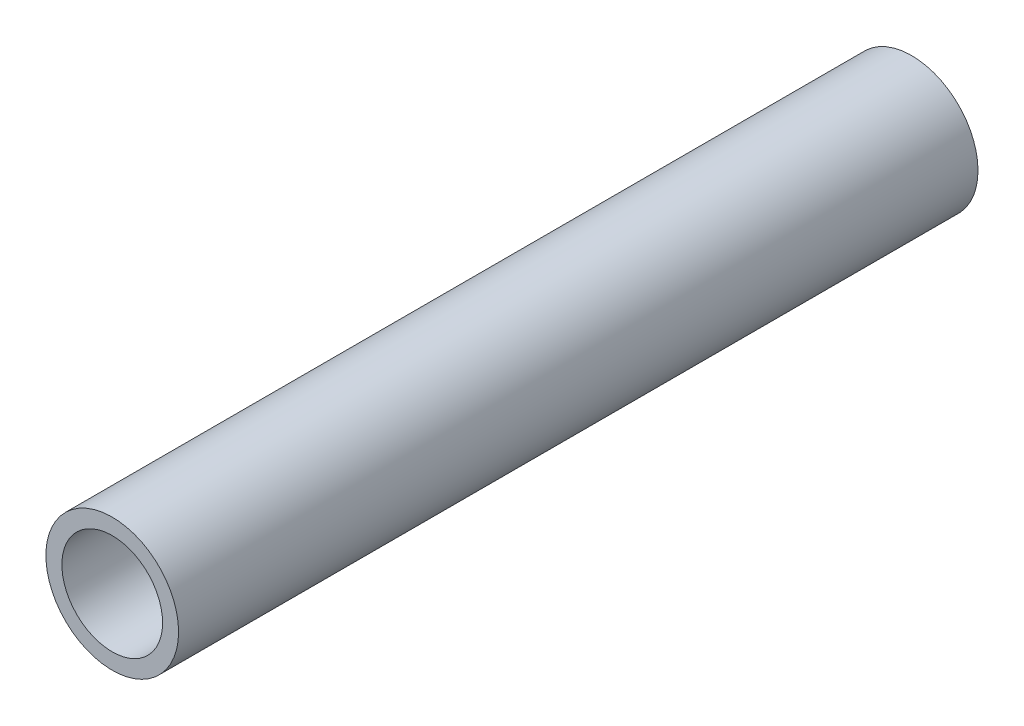
ISO-10303-21;
HEADER;
FILE_DESCRIPTION(('STEP AP214'),'2;1');
FILE_NAME('part.step','',(''),(''),'','','');
FILE_SCHEMA(('AUTOMOTIVE_DESIGN { 1 0 10303 214 1 1 1 1 }'));
ENDSEC;
DATA;
#1=APPLICATION_CONTEXT('core data for automotive mechanical design processes');
#2=APPLICATION_PROTOCOL_DEFINITION('international standard','automotive_design',2000,#1);
#3=PRODUCT_CONTEXT('',#1,'mechanical');
#4=PRODUCT('Part','Part','',(#3));
#5=PRODUCT_RELATED_PRODUCT_CATEGORY('part','',(#4));
#6=PRODUCT_DEFINITION_FORMATION('','',#4);
#7=PRODUCT_DEFINITION_CONTEXT('part definition',#1,'design');
#8=PRODUCT_DEFINITION('design','',#6,#7);
#9=PRODUCT_DEFINITION_SHAPE('','',#8);
#10=(LENGTH_UNIT() NAMED_UNIT(*) SI_UNIT(.MILLI.,.METRE.));
#11=(NAMED_UNIT(*) PLANE_ANGLE_UNIT() SI_UNIT($,.RADIAN.));
#12=(NAMED_UNIT(*) SI_UNIT($,.STERADIAN.) SOLID_ANGLE_UNIT());
#13=UNCERTAINTY_MEASURE_WITH_UNIT(LENGTH_MEASURE(1.E-05),#10,'distance_accuracy_value','');
#14=(GEOMETRIC_REPRESENTATION_CONTEXT(3) GLOBAL_UNCERTAINTY_ASSIGNED_CONTEXT((#13)) GLOBAL_UNIT_ASSIGNED_CONTEXT((#10,
#11,#12)) REPRESENTATION_CONTEXT('',''));
#15=CARTESIAN_POINT('',(0.,0.,0.));
#16=DIRECTION('',(0.,0.,1.));
#17=DIRECTION('',(1.,0.,0.));
#18=AXIS2_PLACEMENT_3D('',#15,#16,#17);
#19=CARTESIAN_POINT('',(0.,0.,500.));
#20=DIRECTION('',(0.,0.,1.));
#21=DIRECTION('',(1.,0.,0.));
#22=AXIS2_PLACEMENT_3D('',#19,#20,#21);
#23=PLANE('',#22);
#24=CARTESIAN_POINT('',(0.,0.,500.));
#25=DIRECTION('',(0.,0.,1.));
#26=DIRECTION('',(1.,0.,0.));
#27=AXIS2_PLACEMENT_3D('',#24,#25,#26);
#28=CIRCLE('',#27,41.5);
#29=CARTESIAN_POINT('',(41.5,0.,500.));
#30=VERTEX_POINT('',#29);
#31=EDGE_CURVE('E10',#30,#30,#28,.T.);
#32=ORIENTED_EDGE('',*,*,#31,.T.);
#33=EDGE_LOOP('',(#32));
#34=FACE_BOUND('',#33,.T.);
#35=CARTESIAN_POINT('',(0.,0.,500.));
#36=DIRECTION('',(0.,0.,1.));
#37=DIRECTION('',(1.,0.,0.));
#38=AXIS2_PLACEMENT_3D('',#35,#36,#37);
#39=CIRCLE('',#38,31.5);
#40=CARTESIAN_POINT('',(31.5,0.,500.));
#41=VERTEX_POINT('',#40);
#42=EDGE_CURVE('E42',#41,#41,#39,.T.);
#43=ORIENTED_EDGE('',*,*,#42,.F.);
#44=EDGE_LOOP('',(#43));
#45=FACE_BOUND('',#44,.T.);
#46=ADVANCED_FACE('F31',(#34,#45),#23,.T.);
#47=CARTESIAN_POINT('',(0.,0.,0.));
#48=DIRECTION('',(0.,0.,1.));
#49=DIRECTION('',(1.,0.,0.));
#50=AXIS2_PLACEMENT_3D('',#47,#48,#49);
#51=PLANE('',#50);
#52=CARTESIAN_POINT('',(0.,0.,0.));
#53=DIRECTION('',(0.,0.,1.));
#54=DIRECTION('',(1.,0.,0.));
#55=AXIS2_PLACEMENT_3D('',#52,#53,#54);
#56=CIRCLE('',#55,41.5);
#57=CARTESIAN_POINT('',(41.5,0.,0.));
#58=VERTEX_POINT('',#57);
#59=EDGE_CURVE('E35',#58,#58,#56,.T.);
#60=ORIENTED_EDGE('',*,*,#59,.F.);
#61=EDGE_LOOP('',(#60));
#62=FACE_BOUND('',#61,.T.);
#63=CARTESIAN_POINT('',(0.,0.,0.));
#64=DIRECTION('',(0.,0.,1.));
#65=DIRECTION('',(1.,0.,0.));
#66=AXIS2_PLACEMENT_3D('',#63,#64,#65);
#67=CIRCLE('',#66,31.5);
#68=CARTESIAN_POINT('',(31.5,0.,0.));
#69=VERTEX_POINT('',#68);
#70=EDGE_CURVE('E44',#69,#69,#67,.T.);
#71=ORIENTED_EDGE('',*,*,#70,.T.);
#72=EDGE_LOOP('',(#71));
#73=FACE_BOUND('',#72,.T.);
#74=ADVANCED_FACE('F54',(#62,#73),#51,.F.);
#75=CARTESIAN_POINT('',(0.,0.,500.));
#76=DIRECTION('',(0.,0.,-1.));
#77=DIRECTION('',(-1.,0.,0.));
#78=AXIS2_PLACEMENT_3D('',#75,#76,#77);
#79=CYLINDRICAL_SURFACE('',#78,41.5);
#80=ORIENTED_EDGE('',*,*,#31,.F.);
#81=EDGE_LOOP('',(#80));
#82=FACE_BOUND('',#81,.T.);
#83=ORIENTED_EDGE('',*,*,#59,.T.);
#84=EDGE_LOOP('',(#83));
#85=FACE_BOUND('',#84,.T.);
#86=ADVANCED_FACE('F33',(#82,#85),#79,.T.);
#87=CARTESIAN_POINT('',(0.,0.,500.));
#88=DIRECTION('',(0.,0.,-1.));
#89=DIRECTION('',(-1.,0.,0.));
#90=AXIS2_PLACEMENT_3D('',#87,#88,#89);
#91=CYLINDRICAL_SURFACE('',#90,31.5);
#92=ORIENTED_EDGE('',*,*,#42,.T.);
#93=EDGE_LOOP('',(#92));
#94=FACE_BOUND('',#93,.T.);
#95=ORIENTED_EDGE('',*,*,#70,.F.);
#96=EDGE_LOOP('',(#95));
#97=FACE_BOUND('',#96,.T.);
#98=ADVANCED_FACE('F50',(#94,#97),#91,.F.);
#99=CLOSED_SHELL('',(#46,#74,#86,#98));
#100=MANIFOLD_SOLID_BREP('B2',#99);
#101=ADVANCED_BREP_SHAPE_REPRESENTATION('',(#18,#100),#14);
#102=SHAPE_DEFINITION_REPRESENTATION(#9,#101);
ENDSEC;
END-ISO-10303-21;
